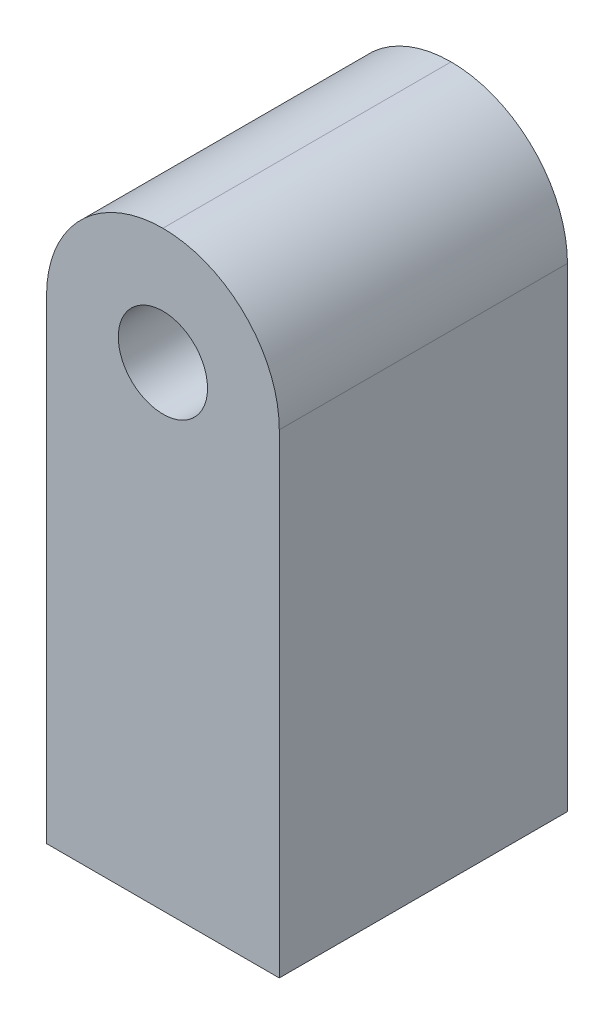
ISO-10303-21;
HEADER;
FILE_DESCRIPTION(('STEP AP214'),'2;1');
FILE_NAME('part.step','',(''),(''),'','','');
FILE_SCHEMA(('AUTOMOTIVE_DESIGN { 1 0 10303 214 1 1 1 1 }'));
ENDSEC;
DATA;
#1=APPLICATION_CONTEXT('core data for automotive mechanical design processes');
#2=APPLICATION_PROTOCOL_DEFINITION('international standard','automotive_design',2000,#1);
#3=PRODUCT_CONTEXT('',#1,'mechanical');
#4=PRODUCT('Part','Part','',(#3));
#5=PRODUCT_RELATED_PRODUCT_CATEGORY('part','',(#4));
#6=PRODUCT_DEFINITION_FORMATION('','',#4);
#7=PRODUCT_DEFINITION_CONTEXT('part definition',#1,'design');
#8=PRODUCT_DEFINITION('design','',#6,#7);
#9=PRODUCT_DEFINITION_SHAPE('','',#8);
#10=(LENGTH_UNIT() NAMED_UNIT(*) SI_UNIT(.MILLI.,.METRE.));
#11=(NAMED_UNIT(*) PLANE_ANGLE_UNIT() SI_UNIT($,.RADIAN.));
#12=(NAMED_UNIT(*) SI_UNIT($,.STERADIAN.) SOLID_ANGLE_UNIT());
#13=UNCERTAINTY_MEASURE_WITH_UNIT(LENGTH_MEASURE(1.E-05),#10,'distance_accuracy_value','');
#14=(GEOMETRIC_REPRESENTATION_CONTEXT(3) GLOBAL_UNCERTAINTY_ASSIGNED_CONTEXT((#13)) GLOBAL_UNIT_ASSIGNED_CONTEXT((#10,
#11,#12)) REPRESENTATION_CONTEXT('',''));
#15=CARTESIAN_POINT('',(0.,0.,0.));
#16=DIRECTION('',(0.,0.,1.));
#17=DIRECTION('',(1.,0.,0.));
#18=AXIS2_PLACEMENT_3D('',#15,#16,#17);
#19=CARTESIAN_POINT('',(0.,0.,49.53));
#20=DIRECTION('',(1.,0.,0.));
#21=DIRECTION('',(0.,0.,-1.));
#22=AXIS2_PLACEMENT_3D('',#19,#20,#21);
#23=PLANE('',#22);
#24=DIRECTION('',(0.,-1.,0.));
#25=VECTOR('',#24,1.);
#26=CARTESIAN_POINT('',(0.,0.,49.53));
#27=LINE('',#26,#25);
#28=CARTESIAN_POINT('',(0.,81.6,49.53));
#29=VERTEX_POINT('',#28);
#30=CARTESIAN_POINT('',(0.,0.,49.53));
#31=VERTEX_POINT('',#30);
#32=EDGE_CURVE('E75',#29,#31,#27,.T.);
#33=ORIENTED_EDGE('',*,*,#32,.F.);
#34=DIRECTION('',(0.,0.,-1.));
#35=VECTOR('',#34,1.);
#36=CARTESIAN_POINT('',(0.,81.6,49.53));
#37=LINE('',#36,#35);
#38=CARTESIAN_POINT('',(0.,81.6,0.));
#39=VERTEX_POINT('',#38);
#40=EDGE_CURVE('E11',#29,#39,#37,.T.);
#41=ORIENTED_EDGE('',*,*,#40,.T.);
#42=DIRECTION('',(0.,-1.,0.));
#43=VECTOR('',#42,1.);
#44=CARTESIAN_POINT('',(0.,0.,0.));
#45=LINE('',#44,#43);
#46=CARTESIAN_POINT('',(0.,0.,0.));
#47=VERTEX_POINT('',#46);
#48=EDGE_CURVE('E95',#39,#47,#45,.T.);
#49=ORIENTED_EDGE('',*,*,#48,.T.);
#50=DIRECTION('',(0.,0.,-1.));
#51=VECTOR('',#50,1.);
#52=CARTESIAN_POINT('',(0.,0.,49.53));
#53=LINE('',#52,#51);
#54=EDGE_CURVE('E88',#31,#47,#53,.T.);
#55=ORIENTED_EDGE('',*,*,#54,.F.);
#56=EDGE_LOOP('',(#33,#41,#49,#55));
#57=FACE_BOUND('',#56,.T.);
#58=ADVANCED_FACE('F33',(#57),#23,.F.);
#59=CARTESIAN_POINT('',(0.,0.,49.53));
#60=DIRECTION('',(0.,1.,0.));
#61=DIRECTION('',(0.,0.,1.));
#62=AXIS2_PLACEMENT_3D('',#59,#60,#61);
#63=PLANE('',#62);
#64=DIRECTION('',(1.,0.,0.));
#65=VECTOR('',#64,1.);
#66=CARTESIAN_POINT('',(0.,0.,0.));
#67=LINE('',#66,#65);
#68=CARTESIAN_POINT('',(40.,0.,0.));
#69=VERTEX_POINT('',#68);
#70=EDGE_CURVE('E114',#47,#69,#67,.T.);
#71=ORIENTED_EDGE('',*,*,#70,.T.);
#72=DIRECTION('',(0.,0.,-1.));
#73=VECTOR('',#72,1.);
#74=CARTESIAN_POINT('',(40.,0.,49.53));
#75=LINE('',#74,#73);
#76=CARTESIAN_POINT('',(40.,0.,49.53));
#77=VERTEX_POINT('',#76);
#78=EDGE_CURVE('E90',#77,#69,#75,.T.);
#79=ORIENTED_EDGE('',*,*,#78,.F.);
#80=DIRECTION('',(1.,0.,0.));
#81=VECTOR('',#80,1.);
#82=CARTESIAN_POINT('',(0.,0.,49.53));
#83=LINE('',#82,#81);
#84=EDGE_CURVE('E78',#31,#77,#83,.T.);
#85=ORIENTED_EDGE('',*,*,#84,.F.);
#86=ORIENTED_EDGE('',*,*,#54,.T.);
#87=EDGE_LOOP('',(#71,#79,#85,#86));
#88=FACE_BOUND('',#87,.T.);
#89=ADVANCED_FACE('F87',(#88),#63,.F.);
#90=CARTESIAN_POINT('',(40.,0.,49.53));
#91=DIRECTION('',(-1.,0.,0.));
#92=DIRECTION('',(0.,0.,1.));
#93=AXIS2_PLACEMENT_3D('',#90,#91,#92);
#94=PLANE('',#93);
#95=DIRECTION('',(0.,1.,0.));
#96=VECTOR('',#95,1.);
#97=CARTESIAN_POINT('',(40.,0.,0.));
#98=LINE('',#97,#96);
#99=CARTESIAN_POINT('',(40.,81.6,0.));
#100=VERTEX_POINT('',#99);
#101=EDGE_CURVE('E83',#69,#100,#98,.T.);
#102=ORIENTED_EDGE('',*,*,#101,.T.);
#103=DIRECTION('',(0.,0.,-1.));
#104=VECTOR('',#103,1.);
#105=CARTESIAN_POINT('',(40.,81.6,49.53));
#106=LINE('',#105,#104);
#107=CARTESIAN_POINT('',(40.,81.6,49.53));
#108=VERTEX_POINT('',#107);
#109=EDGE_CURVE('E105',#100,#108,#106,.F.);
#110=ORIENTED_EDGE('',*,*,#109,.T.);
#111=DIRECTION('',(0.,1.,0.));
#112=VECTOR('',#111,1.);
#113=CARTESIAN_POINT('',(40.,0.,49.53));
#114=LINE('',#113,#112);
#115=EDGE_CURVE('E92',#77,#108,#114,.T.);
#116=ORIENTED_EDGE('',*,*,#115,.F.);
#117=ORIENTED_EDGE('',*,*,#78,.T.);
#118=EDGE_LOOP('',(#102,#110,#116,#117));
#119=FACE_BOUND('',#118,.T.);
#120=ADVANCED_FACE('F130',(#119),#94,.F.);
#121=CARTESIAN_POINT('',(0.,0.,49.53));
#122=DIRECTION('',(0.,0.,-1.));
#123=DIRECTION('',(-1.,0.,0.));
#124=AXIS2_PLACEMENT_3D('',#121,#122,#123);
#125=PLANE('',#124);
#126=CARTESIAN_POINT('',(20.,81.6,49.53));
#127=DIRECTION('',(0.,0.,1.));
#128=DIRECTION('',(1.,0.,0.));
#129=AXIS2_PLACEMENT_3D('',#126,#127,#128);
#130=CIRCLE('',#129,7.67000000000001);
#131=CARTESIAN_POINT('',(27.67,81.6,49.53));
#132=VERTEX_POINT('',#131);
#133=EDGE_CURVE('E117',#132,#132,#130,.T.);
#134=ORIENTED_EDGE('',*,*,#133,.F.);
#135=EDGE_LOOP('',(#134));
#136=FACE_BOUND('',#135,.T.);
#137=ORIENTED_EDGE('',*,*,#115,.T.);
#138=CARTESIAN_POINT('',(20.,81.6,49.53));
#139=DIRECTION('',(0.,0.,-1.));
#140=DIRECTION('',(-1.,0.,0.));
#141=AXIS2_PLACEMENT_3D('',#138,#139,#140);
#142=CIRCLE('',#141,20.);
#143=CARTESIAN_POINT('',(20.,101.6,49.53));
#144=VERTEX_POINT('',#143);
#145=EDGE_CURVE('E42',#108,#144,#142,.F.);
#146=ORIENTED_EDGE('',*,*,#145,.T.);
#147=CARTESIAN_POINT('',(20.,81.6,49.53));
#148=DIRECTION('',(0.,0.,-1.));
#149=DIRECTION('',(-1.,0.,0.));
#150=AXIS2_PLACEMENT_3D('',#147,#148,#149);
#151=CIRCLE('',#150,20.);
#152=EDGE_CURVE('E53',#144,#29,#151,.F.);
#153=ORIENTED_EDGE('',*,*,#152,.T.);
#154=ORIENTED_EDGE('',*,*,#32,.T.);
#155=ORIENTED_EDGE('',*,*,#84,.T.);
#156=EDGE_LOOP('',(#137,#146,#153,#154,#155));
#157=FACE_BOUND('',#156,.T.);
#158=ADVANCED_FACE('F77',(#136,#157),#125,.F.);
#159=CARTESIAN_POINT('',(0.,0.,0.));
#160=DIRECTION('',(0.,0.,-1.));
#161=DIRECTION('',(-1.,0.,0.));
#162=AXIS2_PLACEMENT_3D('',#159,#160,#161);
#163=PLANE('',#162);
#164=CARTESIAN_POINT('',(20.,81.6,0.));
#165=DIRECTION('',(0.,0.,-1.));
#166=DIRECTION('',(-1.,0.,0.));
#167=AXIS2_PLACEMENT_3D('',#164,#165,#166);
#168=CIRCLE('',#167,7.67000000000001);
#169=CARTESIAN_POINT('',(27.67,81.6,0.));
#170=VERTEX_POINT('',#169);
#171=EDGE_CURVE('E37',#170,#170,#168,.T.);
#172=ORIENTED_EDGE('',*,*,#171,.F.);
#173=EDGE_LOOP('',(#172));
#174=FACE_BOUND('',#173,.T.);
#175=CARTESIAN_POINT('',(20.,81.6,0.));
#176=DIRECTION('',(0.,0.,-1.));
#177=DIRECTION('',(-1.,0.,0.));
#178=AXIS2_PLACEMENT_3D('',#175,#176,#177);
#179=CIRCLE('',#178,20.);
#180=CARTESIAN_POINT('',(20.,101.6,0.));
#181=VERTEX_POINT('',#180);
#182=EDGE_CURVE('E97',#39,#181,#179,.T.);
#183=ORIENTED_EDGE('',*,*,#182,.T.);
#184=CARTESIAN_POINT('',(20.,81.6,0.));
#185=DIRECTION('',(0.,0.,-1.));
#186=DIRECTION('',(-1.,0.,0.));
#187=AXIS2_PLACEMENT_3D('',#184,#185,#186);
#188=CIRCLE('',#187,20.);
#189=EDGE_CURVE('E99',#181,#100,#188,.T.);
#190=ORIENTED_EDGE('',*,*,#189,.T.);
#191=ORIENTED_EDGE('',*,*,#101,.F.);
#192=ORIENTED_EDGE('',*,*,#70,.F.);
#193=ORIENTED_EDGE('',*,*,#48,.F.);
#194=EDGE_LOOP('',(#183,#190,#191,#192,#193));
#195=FACE_BOUND('',#194,.T.);
#196=ADVANCED_FACE('F133',(#174,#195),#163,.T.);
#197=CARTESIAN_POINT('',(20.,81.6,49.53));
#198=DIRECTION('',(0.,0.,-1.));
#199=DIRECTION('',(-1.,0.,0.));
#200=AXIS2_PLACEMENT_3D('',#197,#198,#199);
#201=CYLINDRICAL_SURFACE('',#200,20.);
#202=ORIENTED_EDGE('',*,*,#40,.F.);
#203=ORIENTED_EDGE('',*,*,#152,.F.);
#204=DIRECTION('',(0.,0.,-1.));
#205=VECTOR('',#204,1.);
#206=CARTESIAN_POINT('',(20.,101.6,49.53));
#207=LINE('',#206,#205);
#208=EDGE_CURVE('E109',#181,#144,#207,.F.);
#209=ORIENTED_EDGE('',*,*,#208,.F.);
#210=ORIENTED_EDGE('',*,*,#182,.F.);
#211=EDGE_LOOP('',(#202,#203,#209,#210));
#212=FACE_BOUND('',#211,.T.);
#213=ADVANCED_FACE('F35',(#212),#201,.T.);
#214=CARTESIAN_POINT('',(20.,81.6,49.53));
#215=DIRECTION('',(0.,0.,-1.));
#216=DIRECTION('',(-1.,0.,0.));
#217=AXIS2_PLACEMENT_3D('',#214,#215,#216);
#218=CYLINDRICAL_SURFACE('',#217,20.);
#219=ORIENTED_EDGE('',*,*,#145,.F.);
#220=ORIENTED_EDGE('',*,*,#109,.F.);
#221=ORIENTED_EDGE('',*,*,#189,.F.);
#222=ORIENTED_EDGE('',*,*,#208,.T.);
#223=EDGE_LOOP('',(#219,#220,#221,#222));
#224=FACE_BOUND('',#223,.T.);
#225=ADVANCED_FACE('F132',(#224),#218,.T.);
#226=CARTESIAN_POINT('',(20.,81.6,-1.2E-05));
#227=DIRECTION('',(0.,0.,1.));
#228=DIRECTION('',(1.,0.,0.));
#229=AXIS2_PLACEMENT_3D('',#226,#227,#228);
#230=CYLINDRICAL_SURFACE('',#229,7.67000000000001);
#231=CARTESIAN_POINT('',(27.67,81.6,0.));
#232=CARTESIAN_POINT('',(27.67,81.6,0.515937499999999));
#233=CARTESIAN_POINT('',(27.67,81.6,1.031875));
#234=CARTESIAN_POINT('',(27.67,81.6,2.06375));
#235=CARTESIAN_POINT('',(27.67,81.6,2.5796875));
#236=CARTESIAN_POINT('',(27.67,81.6,3.6115625));
#237=CARTESIAN_POINT('',(27.67,81.6,4.1275));
#238=CARTESIAN_POINT('',(27.67,81.6,5.159375));
#239=CARTESIAN_POINT('',(27.67,81.6,5.6753125));
#240=CARTESIAN_POINT('',(27.67,81.6,6.7071875));
#241=CARTESIAN_POINT('',(27.67,81.6,7.223125));
#242=CARTESIAN_POINT('',(27.67,81.6,8.255));
#243=CARTESIAN_POINT('',(27.67,81.6,8.7709375));
#244=CARTESIAN_POINT('',(27.67,81.6,9.8028125));
#245=CARTESIAN_POINT('',(27.67,81.6,10.31875));
#246=CARTESIAN_POINT('',(27.67,81.6,11.350625));
#247=CARTESIAN_POINT('',(27.67,81.6,11.8665625));
#248=CARTESIAN_POINT('',(27.67,81.6,12.8984375));
#249=CARTESIAN_POINT('',(27.67,81.6,13.414375));
#250=CARTESIAN_POINT('',(27.67,81.6,14.44625));
#251=CARTESIAN_POINT('',(27.67,81.6,14.9621875));
#252=CARTESIAN_POINT('',(27.67,81.6,15.9940625));
#253=CARTESIAN_POINT('',(27.67,81.6,16.51));
#254=CARTESIAN_POINT('',(27.67,81.6,17.541875));
#255=CARTESIAN_POINT('',(27.67,81.6,18.0578125));
#256=CARTESIAN_POINT('',(27.67,81.6,19.0896875));
#257=CARTESIAN_POINT('',(27.67,81.6,19.605625));
#258=CARTESIAN_POINT('',(27.67,81.6,20.6375));
#259=CARTESIAN_POINT('',(27.67,81.6,21.1534375));
#260=CARTESIAN_POINT('',(27.67,81.6,22.1853125));
#261=CARTESIAN_POINT('',(27.67,81.6,22.70125));
#262=CARTESIAN_POINT('',(27.67,81.6,23.733125));
#263=CARTESIAN_POINT('',(27.67,81.6,24.2490625));
#264=CARTESIAN_POINT('',(27.67,81.6,25.2809375));
#265=CARTESIAN_POINT('',(27.67,81.6,25.796875));
#266=CARTESIAN_POINT('',(27.67,81.6,26.82875));
#267=CARTESIAN_POINT('',(27.67,81.6,27.3446875));
#268=CARTESIAN_POINT('',(27.67,81.6,28.3765625));
#269=CARTESIAN_POINT('',(27.67,81.6,28.8925));
#270=CARTESIAN_POINT('',(27.67,81.6,29.924375));
#271=CARTESIAN_POINT('',(27.67,81.6,30.4403125));
#272=CARTESIAN_POINT('',(27.67,81.6,31.4721875));
#273=CARTESIAN_POINT('',(27.67,81.6,31.988125));
#274=CARTESIAN_POINT('',(27.67,81.6,33.02));
#275=CARTESIAN_POINT('',(27.67,81.6,33.5359375));
#276=CARTESIAN_POINT('',(27.67,81.6,34.5678125));
#277=CARTESIAN_POINT('',(27.67,81.6,35.08375));
#278=CARTESIAN_POINT('',(27.67,81.6,36.115625));
#279=CARTESIAN_POINT('',(27.67,81.6,36.6315625));
#280=CARTESIAN_POINT('',(27.67,81.6,37.6634375));
#281=CARTESIAN_POINT('',(27.67,81.6,38.179375));
#282=CARTESIAN_POINT('',(27.67,81.6,39.21125));
#283=CARTESIAN_POINT('',(27.67,81.6,39.7271875));
#284=CARTESIAN_POINT('',(27.67,81.6,40.7590625));
#285=CARTESIAN_POINT('',(27.67,81.6,41.275));
#286=CARTESIAN_POINT('',(27.67,81.6,42.306875));
#287=CARTESIAN_POINT('',(27.67,81.6,42.8228125));
#288=CARTESIAN_POINT('',(27.67,81.6,43.8546875));
#289=CARTESIAN_POINT('',(27.67,81.6,44.370625));
#290=CARTESIAN_POINT('',(27.67,81.6,45.4025));
#291=CARTESIAN_POINT('',(27.67,81.6,45.9184375));
#292=CARTESIAN_POINT('',(27.67,81.6,46.9503125));
#293=CARTESIAN_POINT('',(27.67,81.6,47.46625));
#294=CARTESIAN_POINT('',(27.67,81.6,48.498125));
#295=CARTESIAN_POINT('',(27.67,81.6,49.0140625));
#296=CARTESIAN_POINT('',(27.67,81.6,49.53));
#297=B_SPLINE_CURVE_WITH_KNOTS('',3,(#231,#232,#233,#234,#235,#236,#237,#238,#239,#240,#241,
#242,#243,#244,#245,#246,#247,#248,#249,#250,#251,#252,#253,#254,#255,#256,#257,#258,#259,#260,
#261,#262,#263,#264,#265,#266,#267,#268,#269,#270,#271,#272,#273,#274,#275,#276,#277,#278,#279,
#280,#281,#282,#283,#284,#285,#286,#287,#288,#289,#290,#291,#292,#293,#294,#295,#296),
.UNSPECIFIED.,.F.,.F.,(4,2,2,2,2,2,2,2,2,2,2,2,2,2,2,2,2,2,2,2,2,2,2,2,2,2,2,2,2,2,2,2,4),(0.,
1.5478125,3.095625,4.6434375,6.19125,7.7390625,9.286875,10.8346875,12.3825,13.9303125,15.478125,
17.0259375,18.57375,20.1215625,21.669375,23.2171875,24.765,26.3128125,27.860625,29.4084375,
30.95625,32.5040625,34.051875,35.5996875,37.1475,38.6953125,40.243125,41.7909375,43.33875,
44.8865625,46.434375,47.9821875,49.53),.UNSPECIFIED.);
#298=EDGE_CURVE('BSEAM141',#170,#132,#297,.T.);
#299=ORIENTED_EDGE('',*,*,#171,.T.);
#300=ORIENTED_EDGE('',*,*,#133,.T.);
#301=ORIENTED_EDGE('',*,*,#298,.T.);
#302=ORIENTED_EDGE('',*,*,#298,.F.);
#303=EDGE_LOOP('',(#299,#301,#300,#302));
#304=FACE_BOUND('',#303,.T.);
#305=ADVANCED_FACE('F141',(#304),#230,.F.);
#306=CLOSED_SHELL('',(#58,#89,#120,#158,#196,#213,#225,#305));
#307=MANIFOLD_SOLID_BREP('B2',#306);
#308=ADVANCED_BREP_SHAPE_REPRESENTATION('',(#18,#307),#14);
#309=SHAPE_DEFINITION_REPRESENTATION(#9,#308);
ENDSEC;
END-ISO-10303-21;
